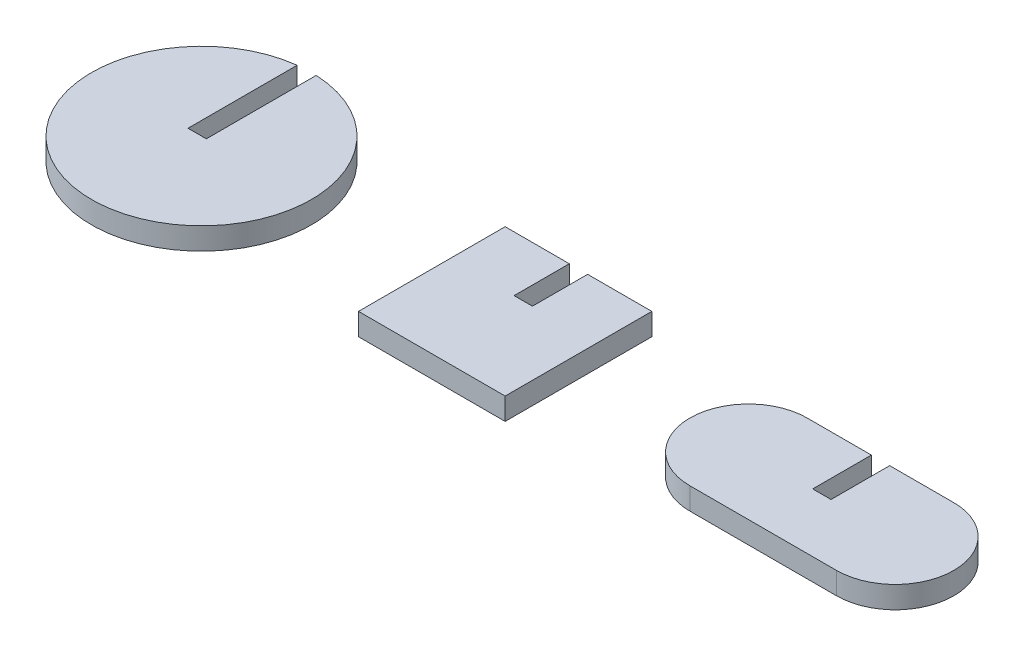
ISO-10303-21;
HEADER;
FILE_DESCRIPTION(('STEP AP214'),'2;1');
FILE_NAME('part.step','',(''),(''),'','','');
FILE_SCHEMA(('AUTOMOTIVE_DESIGN { 1 0 10303 214 1 1 1 1 }'));
ENDSEC;
DATA;
#1=APPLICATION_CONTEXT('core data for automotive mechanical design processes');
#2=APPLICATION_PROTOCOL_DEFINITION('international standard','automotive_design',2000,#1);
#3=PRODUCT_CONTEXT('',#1,'mechanical');
#4=PRODUCT('Part','Part','',(#3));
#5=PRODUCT_RELATED_PRODUCT_CATEGORY('part','',(#4));
#6=PRODUCT_DEFINITION_FORMATION('','',#4);
#7=PRODUCT_DEFINITION_CONTEXT('part definition',#1,'design');
#8=PRODUCT_DEFINITION('design','',#6,#7);
#9=PRODUCT_DEFINITION_SHAPE('','',#8);
#10=(LENGTH_UNIT() NAMED_UNIT(*) SI_UNIT(.MILLI.,.METRE.));
#11=(NAMED_UNIT(*) PLANE_ANGLE_UNIT() SI_UNIT($,.RADIAN.));
#12=(NAMED_UNIT(*) SI_UNIT($,.STERADIAN.) SOLID_ANGLE_UNIT());
#13=UNCERTAINTY_MEASURE_WITH_UNIT(LENGTH_MEASURE(1.E-05),#10,'distance_accuracy_value','');
#14=(GEOMETRIC_REPRESENTATION_CONTEXT(3) GLOBAL_UNCERTAINTY_ASSIGNED_CONTEXT((#13)) GLOBAL_UNIT_ASSIGNED_CONTEXT((#10,
#11,#12)) REPRESENTATION_CONTEXT('',''));
#15=CARTESIAN_POINT('',(0.,0.,0.));
#16=DIRECTION('',(0.,0.,1.));
#17=DIRECTION('',(1.,0.,0.));
#18=AXIS2_PLACEMENT_3D('',#15,#16,#17);
#19=CARTESIAN_POINT('',(104.876295825867,3.,1.80892643883336));
#20=DIRECTION('',(0.,-1.,0.));
#21=DIRECTION('',(0.,0.,-1.));
#22=AXIS2_PLACEMENT_3D('',#19,#20,#21);
#23=CYLINDRICAL_SURFACE('',#22,8.);
#24=CARTESIAN_POINT('',(104.876295825867,0.,1.80892643883336));
#25=DIRECTION('',(0.,1.,0.));
#26=DIRECTION('',(0.,0.,1.));
#27=AXIS2_PLACEMENT_3D('',#24,#25,#26);
#28=CIRCLE('',#27,8.);
#29=CARTESIAN_POINT('',(104.876295825867,0.,-6.19107356116664));
#30=VERTEX_POINT('',#29);
#31=CARTESIAN_POINT('',(104.876295825867,0.,9.80892643883336));
#32=VERTEX_POINT('',#31);
#33=EDGE_CURVE('E12',#30,#32,#28,.T.);
#34=ORIENTED_EDGE('',*,*,#33,.T.);
#35=DIRECTION('',(0.,-1.,0.));
#36=VECTOR('',#35,1.);
#37=CARTESIAN_POINT('',(104.876295825867,3.,9.80892643883336));
#38=LINE('',#37,#36);
#39=CARTESIAN_POINT('',(104.876295825867,3.,9.80892643883336));
#40=VERTEX_POINT('',#39);
#41=EDGE_CURVE('E187',#40,#32,#38,.T.);
#42=ORIENTED_EDGE('',*,*,#41,.F.);
#43=CARTESIAN_POINT('',(104.876295825867,3.,1.80892643883336));
#44=DIRECTION('',(0.,1.,0.));
#45=DIRECTION('',(0.,0.,1.));
#46=AXIS2_PLACEMENT_3D('',#43,#44,#45);
#47=CIRCLE('',#46,8.);
#48=CARTESIAN_POINT('',(104.876295825867,3.,-6.19107356116664));
#49=VERTEX_POINT('',#48);
#50=EDGE_CURVE('E53',#49,#40,#47,.T.);
#51=ORIENTED_EDGE('',*,*,#50,.F.);
#52=DIRECTION('',(0.,-1.,0.));
#53=VECTOR('',#52,1.);
#54=CARTESIAN_POINT('',(104.876295825867,3.,-6.19107356116664));
#55=LINE('',#54,#53);
#56=EDGE_CURVE('E152',#49,#30,#55,.T.);
#57=ORIENTED_EDGE('',*,*,#56,.T.);
#58=EDGE_LOOP('',(#34,#42,#51,#57));
#59=FACE_BOUND('',#58,.T.);
#60=ADVANCED_FACE('F49',(#59),#23,.T.);
#61=CARTESIAN_POINT('',(104.876295825867,3.,9.80892643883336));
#62=DIRECTION('',(0.,0.,-1.));
#63=DIRECTION('',(-1.,0.,0.));
#64=AXIS2_PLACEMENT_3D('',#61,#62,#63);
#65=PLANE('',#64);
#66=DIRECTION('',(1.,0.,0.));
#67=VECTOR('',#66,1.);
#68=CARTESIAN_POINT('',(104.876295825867,0.,9.80892643883336));
#69=LINE('',#68,#67);
#70=CARTESIAN_POINT('',(124.876295825867,0.,9.80892643883336));
#71=VERTEX_POINT('',#70);
#72=EDGE_CURVE('E58',#32,#71,#69,.T.);
#73=ORIENTED_EDGE('',*,*,#72,.T.);
#74=DIRECTION('',(0.,-1.,0.));
#75=VECTOR('',#74,1.);
#76=CARTESIAN_POINT('',(124.876295825867,3.,9.80892643883336));
#77=LINE('',#76,#75);
#78=CARTESIAN_POINT('',(124.876295825867,3.,9.80892643883336));
#79=VERTEX_POINT('',#78);
#80=EDGE_CURVE('E128',#79,#71,#77,.T.);
#81=ORIENTED_EDGE('',*,*,#80,.F.);
#82=DIRECTION('',(1.,0.,0.));
#83=VECTOR('',#82,1.);
#84=CARTESIAN_POINT('',(104.876295825867,3.,9.80892643883336));
#85=LINE('',#84,#83);
#86=EDGE_CURVE('E96',#40,#79,#85,.T.);
#87=ORIENTED_EDGE('',*,*,#86,.F.);
#88=ORIENTED_EDGE('',*,*,#41,.T.);
#89=EDGE_LOOP('',(#73,#81,#87,#88));
#90=FACE_BOUND('',#89,.T.);
#91=ADVANCED_FACE('F194',(#90),#65,.F.);
#92=CARTESIAN_POINT('',(124.876295825867,3.,1.80892643883336));
#93=DIRECTION('',(0.,-1.,0.));
#94=DIRECTION('',(0.,0.,-1.));
#95=AXIS2_PLACEMENT_3D('',#92,#93,#94);
#96=CYLINDRICAL_SURFACE('',#95,8.);
#97=CARTESIAN_POINT('',(124.876295825867,0.,1.80892643883336));
#98=DIRECTION('',(0.,1.,0.));
#99=DIRECTION('',(0.,0.,1.));
#100=AXIS2_PLACEMENT_3D('',#97,#98,#99);
#101=CIRCLE('',#100,8.);
#102=CARTESIAN_POINT('',(124.876295825867,0.,-6.19107356116664));
#103=VERTEX_POINT('',#102);
#104=EDGE_CURVE('E121',#71,#103,#101,.T.);
#105=ORIENTED_EDGE('',*,*,#104,.T.);
#106=DIRECTION('',(0.,-1.,0.));
#107=VECTOR('',#106,1.);
#108=CARTESIAN_POINT('',(124.876295825867,3.,-6.19107356116664));
#109=LINE('',#108,#107);
#110=CARTESIAN_POINT('',(124.876295825867,3.,-6.19107356116664));
#111=VERTEX_POINT('',#110);
#112=EDGE_CURVE('E126',#111,#103,#109,.T.);
#113=ORIENTED_EDGE('',*,*,#112,.F.);
#114=CARTESIAN_POINT('',(124.876295825867,3.,1.80892643883336));
#115=DIRECTION('',(0.,1.,0.));
#116=DIRECTION('',(0.,0.,1.));
#117=AXIS2_PLACEMENT_3D('',#114,#115,#116);
#118=CIRCLE('',#117,8.);
#119=EDGE_CURVE('E161',#79,#111,#118,.T.);
#120=ORIENTED_EDGE('',*,*,#119,.F.);
#121=ORIENTED_EDGE('',*,*,#80,.T.);
#122=EDGE_LOOP('',(#105,#113,#120,#121));
#123=FACE_BOUND('',#122,.T.);
#124=ADVANCED_FACE('F127',(#123),#96,.T.);
#125=CARTESIAN_POINT('',(116.126295825867,3.,-6.19107356116664));
#126=DIRECTION('',(0.,0.,1.));
#127=DIRECTION('',(1.,0.,0.));
#128=AXIS2_PLACEMENT_3D('',#125,#126,#127);
#129=PLANE('',#128);
#130=DIRECTION('',(-1.,0.,0.));
#131=VECTOR('',#130,1.);
#132=CARTESIAN_POINT('',(116.126295825867,0.,-6.19107356116664));
#133=LINE('',#132,#131);
#134=CARTESIAN_POINT('',(116.126295825867,0.,-6.19107356116664));
#135=VERTEX_POINT('',#134);
#136=EDGE_CURVE('E135',#103,#135,#133,.T.);
#137=ORIENTED_EDGE('',*,*,#136,.T.);
#138=DIRECTION('',(0.,-1.,0.));
#139=VECTOR('',#138,1.);
#140=CARTESIAN_POINT('',(116.126295825867,3.,-6.19107356116664));
#141=LINE('',#140,#139);
#142=CARTESIAN_POINT('',(116.126295825867,3.,-6.19107356116664));
#143=VERTEX_POINT('',#142);
#144=EDGE_CURVE('E136',#143,#135,#141,.T.);
#145=ORIENTED_EDGE('',*,*,#144,.F.);
#146=DIRECTION('',(-1.,0.,0.));
#147=VECTOR('',#146,1.);
#148=CARTESIAN_POINT('',(116.126295825867,3.,-6.19107356116664));
#149=LINE('',#148,#147);
#150=EDGE_CURVE('E140',#111,#143,#149,.T.);
#151=ORIENTED_EDGE('',*,*,#150,.F.);
#152=ORIENTED_EDGE('',*,*,#112,.T.);
#153=EDGE_LOOP('',(#137,#145,#151,#152));
#154=FACE_BOUND('',#153,.T.);
#155=ADVANCED_FACE('F133',(#154),#129,.F.);
#156=CARTESIAN_POINT('',(116.126295825867,3.,1.80892643883336));
#157=DIRECTION('',(1.,0.,0.));
#158=DIRECTION('',(0.,0.,-1.));
#159=AXIS2_PLACEMENT_3D('',#156,#157,#158);
#160=PLANE('',#159);
#161=DIRECTION('',(0.,0.,1.));
#162=VECTOR('',#161,1.);
#163=CARTESIAN_POINT('',(116.126295825867,0.,1.80892643883336));
#164=LINE('',#163,#162);
#165=CARTESIAN_POINT('',(116.126295825867,0.,1.80892643883336));
#166=VERTEX_POINT('',#165);
#167=EDGE_CURVE('E145',#135,#166,#164,.T.);
#168=ORIENTED_EDGE('',*,*,#167,.T.);
#169=DIRECTION('',(0.,-1.,0.));
#170=VECTOR('',#169,1.);
#171=CARTESIAN_POINT('',(116.126295825867,3.,1.80892643883336));
#172=LINE('',#171,#170);
#173=CARTESIAN_POINT('',(116.126295825867,3.,1.80892643883336));
#174=VERTEX_POINT('',#173);
#175=EDGE_CURVE('E180',#174,#166,#172,.T.);
#176=ORIENTED_EDGE('',*,*,#175,.F.);
#177=DIRECTION('',(0.,0.,1.));
#178=VECTOR('',#177,1.);
#179=CARTESIAN_POINT('',(116.126295825867,3.,1.80892643883336));
#180=LINE('',#179,#178);
#181=EDGE_CURVE('E158',#143,#174,#180,.T.);
#182=ORIENTED_EDGE('',*,*,#181,.F.);
#183=ORIENTED_EDGE('',*,*,#144,.T.);
#184=EDGE_LOOP('',(#168,#176,#182,#183));
#185=FACE_BOUND('',#184,.T.);
#186=ADVANCED_FACE('F193',(#185),#160,.F.);
#187=CARTESIAN_POINT('',(113.626295825867,3.,1.80892643883336));
#188=DIRECTION('',(0.,0.,1.));
#189=DIRECTION('',(1.,0.,0.));
#190=AXIS2_PLACEMENT_3D('',#187,#188,#189);
#191=PLANE('',#190);
#192=DIRECTION('',(-1.,0.,0.));
#193=VECTOR('',#192,1.);
#194=CARTESIAN_POINT('',(113.626295825867,0.,1.80892643883336));
#195=LINE('',#194,#193);
#196=CARTESIAN_POINT('',(113.626295825867,0.,1.80892643883336));
#197=VERTEX_POINT('',#196);
#198=EDGE_CURVE('E148',#166,#197,#195,.T.);
#199=ORIENTED_EDGE('',*,*,#198,.T.);
#200=DIRECTION('',(0.,-1.,0.));
#201=VECTOR('',#200,1.);
#202=CARTESIAN_POINT('',(113.626295825867,3.,1.80892643883336));
#203=LINE('',#202,#201);
#204=CARTESIAN_POINT('',(113.626295825867,3.,1.80892643883336));
#205=VERTEX_POINT('',#204);
#206=EDGE_CURVE('E173',#205,#197,#203,.T.);
#207=ORIENTED_EDGE('',*,*,#206,.F.);
#208=DIRECTION('',(-1.,0.,0.));
#209=VECTOR('',#208,1.);
#210=CARTESIAN_POINT('',(113.626295825867,3.,1.80892643883336));
#211=LINE('',#210,#209);
#212=EDGE_CURVE('E156',#174,#205,#211,.T.);
#213=ORIENTED_EDGE('',*,*,#212,.F.);
#214=ORIENTED_EDGE('',*,*,#175,.T.);
#215=EDGE_LOOP('',(#199,#207,#213,#214));
#216=FACE_BOUND('',#215,.T.);
#217=ADVANCED_FACE('F174',(#216),#191,.F.);
#218=CARTESIAN_POINT('',(113.626295825867,3.,1.80892643883336));
#219=DIRECTION('',(-1.,0.,0.));
#220=DIRECTION('',(0.,0.,1.));
#221=AXIS2_PLACEMENT_3D('',#218,#219,#220);
#222=PLANE('',#221);
#223=DIRECTION('',(0.,0.,-1.));
#224=VECTOR('',#223,1.);
#225=CARTESIAN_POINT('',(113.626295825867,0.,1.80892643883336));
#226=LINE('',#225,#224);
#227=CARTESIAN_POINT('',(113.626295825867,0.,-6.19107356116664));
#228=VERTEX_POINT('',#227);
#229=EDGE_CURVE('E163',#197,#228,#226,.T.);
#230=ORIENTED_EDGE('',*,*,#229,.T.);
#231=DIRECTION('',(0.,-1.,0.));
#232=VECTOR('',#231,1.);
#233=CARTESIAN_POINT('',(113.626295825867,3.,-6.19107356116664));
#234=LINE('',#233,#232);
#235=CARTESIAN_POINT('',(113.626295825867,3.,-6.19107356116664));
#236=VERTEX_POINT('',#235);
#237=EDGE_CURVE('E181',#236,#228,#234,.T.);
#238=ORIENTED_EDGE('',*,*,#237,.F.);
#239=DIRECTION('',(0.,0.,-1.));
#240=VECTOR('',#239,1.);
#241=CARTESIAN_POINT('',(113.626295825867,3.,1.80892643883336));
#242=LINE('',#241,#240);
#243=EDGE_CURVE('E153',#205,#236,#242,.T.);
#244=ORIENTED_EDGE('',*,*,#243,.F.);
#245=ORIENTED_EDGE('',*,*,#206,.T.);
#246=EDGE_LOOP('',(#230,#238,#244,#245));
#247=FACE_BOUND('',#246,.T.);
#248=ADVANCED_FACE('F182',(#247),#222,.F.);
#249=CARTESIAN_POINT('',(104.876295825867,3.,-6.19107356116664));
#250=DIRECTION('',(0.,0.,1.));
#251=DIRECTION('',(1.,0.,0.));
#252=AXIS2_PLACEMENT_3D('',#249,#250,#251);
#253=PLANE('',#252);
#254=DIRECTION('',(-1.,0.,0.));
#255=VECTOR('',#254,1.);
#256=CARTESIAN_POINT('',(104.876295825867,0.,-6.19107356116664));
#257=LINE('',#256,#255);
#258=EDGE_CURVE('E110',#228,#30,#257,.T.);
#259=ORIENTED_EDGE('',*,*,#258,.T.);
#260=ORIENTED_EDGE('',*,*,#56,.F.);
#261=DIRECTION('',(-1.,0.,0.));
#262=VECTOR('',#261,1.);
#263=CARTESIAN_POINT('',(104.876295825867,3.,-6.19107356116664));
#264=LINE('',#263,#262);
#265=EDGE_CURVE('E151',#236,#49,#264,.T.);
#266=ORIENTED_EDGE('',*,*,#265,.F.);
#267=ORIENTED_EDGE('',*,*,#237,.T.);
#268=EDGE_LOOP('',(#259,#260,#266,#267));
#269=FACE_BOUND('',#268,.T.);
#270=ADVANCED_FACE('F198',(#269),#253,.F.);
#271=CARTESIAN_POINT('',(104.876295825867,3.,1.80892643883336));
#272=DIRECTION('',(0.,1.,0.));
#273=DIRECTION('',(0.,0.,1.));
#274=AXIS2_PLACEMENT_3D('',#271,#272,#273);
#275=PLANE('',#274);
#276=ORIENTED_EDGE('',*,*,#50,.T.);
#277=ORIENTED_EDGE('',*,*,#86,.T.);
#278=ORIENTED_EDGE('',*,*,#119,.T.);
#279=ORIENTED_EDGE('',*,*,#150,.T.);
#280=ORIENTED_EDGE('',*,*,#181,.T.);
#281=ORIENTED_EDGE('',*,*,#212,.T.);
#282=ORIENTED_EDGE('',*,*,#243,.T.);
#283=ORIENTED_EDGE('',*,*,#265,.T.);
#284=EDGE_LOOP('',(#276,#277,#278,#279,#280,#281,#282,#283));
#285=FACE_BOUND('',#284,.T.);
#286=ADVANCED_FACE('F55',(#285),#275,.T.);
#287=CARTESIAN_POINT('',(104.876295825867,0.,1.80892643883336));
#288=DIRECTION('',(0.,1.,0.));
#289=DIRECTION('',(0.,0.,1.));
#290=AXIS2_PLACEMENT_3D('',#287,#288,#289);
#291=PLANE('',#290);
#292=ORIENTED_EDGE('',*,*,#33,.F.);
#293=ORIENTED_EDGE('',*,*,#258,.F.);
#294=ORIENTED_EDGE('',*,*,#229,.F.);
#295=ORIENTED_EDGE('',*,*,#198,.F.);
#296=ORIENTED_EDGE('',*,*,#167,.F.);
#297=ORIENTED_EDGE('',*,*,#136,.F.);
#298=ORIENTED_EDGE('',*,*,#104,.F.);
#299=ORIENTED_EDGE('',*,*,#72,.F.);
#300=EDGE_LOOP('',(#292,#293,#294,#295,#296,#297,#298,#299));
#301=FACE_BOUND('',#300,.T.);
#302=ADVANCED_FACE('F142',(#301),#291,.F.);
#303=CLOSED_SHELL('',(#60,#91,#124,#155,#186,#217,#248,#270,#286,#302));
#304=MANIFOLD_SOLID_BREP('B2',#303);
#305=CARTESIAN_POINT('',(30.9354130775893,3.,-13.1764873648477));
#306=DIRECTION('',(1.,0.,0.));
#307=DIRECTION('',(0.,0.,-1.));
#308=AXIS2_PLACEMENT_3D('',#305,#306,#307);
#309=PLANE('',#308);
#310=DIRECTION('',(0.,0.,1.));
#311=VECTOR('',#310,1.);
#312=CARTESIAN_POINT('',(30.9354130775893,0.,-13.1764873648477));
#313=LINE('',#312,#311);
#314=CARTESIAN_POINT('',(30.9354130775893,0.,-13.1764873648477));
#315=VERTEX_POINT('',#314);
#316=CARTESIAN_POINT('',(30.9354130775893,0.,1.80892643883336));
#317=VERTEX_POINT('',#316);
#318=EDGE_CURVE('E48',#315,#317,#313,.T.);
#319=ORIENTED_EDGE('',*,*,#318,.T.);
#320=DIRECTION('',(0.,-1.,0.));
#321=VECTOR('',#320,1.);
#322=CARTESIAN_POINT('',(30.9354130775893,3.,1.80892643883336));
#323=LINE('',#322,#321);
#324=CARTESIAN_POINT('',(30.9354130775893,3.,1.80892643883336));
#325=VERTEX_POINT('',#324);
#326=EDGE_CURVE('E360',#325,#317,#323,.T.);
#327=ORIENTED_EDGE('',*,*,#326,.F.);
#328=DIRECTION('',(0.,0.,1.));
#329=VECTOR('',#328,1.);
#330=CARTESIAN_POINT('',(30.9354130775893,3.,-13.1764873648477));
#331=LINE('',#330,#329);
#332=CARTESIAN_POINT('',(30.9354130775893,3.,-13.1764873648477));
#333=VERTEX_POINT('',#332);
#334=EDGE_CURVE('E292',#333,#325,#331,.T.);
#335=ORIENTED_EDGE('',*,*,#334,.F.);
#336=DIRECTION('',(0.,-1.,0.));
#337=VECTOR('',#336,1.);
#338=CARTESIAN_POINT('',(30.9354130775893,3.,-13.1764873648477));
#339=LINE('',#338,#337);
#340=EDGE_CURVE('E347',#333,#315,#339,.T.);
#341=ORIENTED_EDGE('',*,*,#340,.T.);
#342=EDGE_LOOP('',(#319,#327,#335,#341));
#343=FACE_BOUND('',#342,.T.);
#344=ADVANCED_FACE('F289',(#343),#309,.F.);
#345=CARTESIAN_POINT('',(28.4354130775893,3.,1.80892643883336));
#346=DIRECTION('',(0.,0.,1.));
#347=DIRECTION('',(1.,0.,0.));
#348=AXIS2_PLACEMENT_3D('',#345,#346,#347);
#349=PLANE('',#348);
#350=DIRECTION('',(-1.,0.,0.));
#351=VECTOR('',#350,1.);
#352=CARTESIAN_POINT('',(28.4354130775893,0.,1.80892643883336));
#353=LINE('',#352,#351);
#354=CARTESIAN_POINT('',(28.4354130775893,0.,1.80892643883336));
#355=VERTEX_POINT('',#354);
#356=EDGE_CURVE('E300',#317,#355,#353,.T.);
#357=ORIENTED_EDGE('',*,*,#356,.T.);
#358=DIRECTION('',(0.,-1.,0.));
#359=VECTOR('',#358,1.);
#360=CARTESIAN_POINT('',(28.4354130775893,3.,1.80892643883336));
#361=LINE('',#360,#359);
#362=CARTESIAN_POINT('',(28.4354130775893,3.,1.80892643883336));
#363=VERTEX_POINT('',#362);
#364=EDGE_CURVE('E344',#363,#355,#361,.T.);
#365=ORIENTED_EDGE('',*,*,#364,.F.);
#366=DIRECTION('',(-1.,0.,0.));
#367=VECTOR('',#366,1.);
#368=CARTESIAN_POINT('',(28.4354130775893,3.,1.80892643883336));
#369=LINE('',#368,#367);
#370=EDGE_CURVE('E321',#325,#363,#369,.T.);
#371=ORIENTED_EDGE('',*,*,#370,.F.);
#372=ORIENTED_EDGE('',*,*,#326,.T.);
#373=EDGE_LOOP('',(#357,#365,#371,#372));
#374=FACE_BOUND('',#373,.T.);
#375=ADVANCED_FACE('F363',(#374),#349,.F.);
#376=CARTESIAN_POINT('',(28.4354130775893,3.,-13.0779582741391));
#377=DIRECTION('',(-1.,0.,0.));
#378=DIRECTION('',(0.,0.,1.));
#379=AXIS2_PLACEMENT_3D('',#376,#377,#378);
#380=PLANE('',#379);
#381=DIRECTION('',(0.,0.,-1.));
#382=VECTOR('',#381,1.);
#383=CARTESIAN_POINT('',(28.4354130775893,0.,-13.0779582741391));
#384=LINE('',#383,#382);
#385=CARTESIAN_POINT('',(28.4354130775893,0.,-13.0779582741391));
#386=VERTEX_POINT('',#385);
#387=EDGE_CURVE('E340',#355,#386,#384,.T.);
#388=ORIENTED_EDGE('',*,*,#387,.T.);
#389=DIRECTION('',(0.,-1.,0.));
#390=VECTOR('',#389,1.);
#391=CARTESIAN_POINT('',(28.4354130775893,3.,-13.0779582741391));
#392=LINE('',#391,#390);
#393=CARTESIAN_POINT('',(28.4354130775893,3.,-13.0779582741391));
#394=VERTEX_POINT('',#393);
#395=EDGE_CURVE('E338',#394,#386,#392,.T.);
#396=ORIENTED_EDGE('',*,*,#395,.F.);
#397=DIRECTION('',(0.,0.,-1.));
#398=VECTOR('',#397,1.);
#399=CARTESIAN_POINT('',(28.4354130775893,3.,-13.0779582741391));
#400=LINE('',#399,#398);
#401=EDGE_CURVE('E351',#363,#394,#400,.T.);
#402=ORIENTED_EDGE('',*,*,#401,.F.);
#403=ORIENTED_EDGE('',*,*,#364,.T.);
#404=EDGE_LOOP('',(#388,#396,#402,#403));
#405=FACE_BOUND('',#404,.T.);
#406=ADVANCED_FACE('F339',(#405),#380,.F.);
#407=CARTESIAN_POINT('',(30.2740711596334,3.,1.80892643883336));
#408=DIRECTION('',(0.,-1.,0.));
#409=DIRECTION('',(0.,0.,-1.));
#410=AXIS2_PLACEMENT_3D('',#407,#408,#409);
#411=CYLINDRICAL_SURFACE('',#410,15.);
#412=CARTESIAN_POINT('',(30.2740711596334,0.,1.80892643883336));
#413=DIRECTION('',(0.,1.,0.));
#414=DIRECTION('',(0.,0.,1.));
#415=AXIS2_PLACEMENT_3D('',#412,#413,#414);
#416=CIRCLE('',#415,15.);
#417=EDGE_CURVE('E332',#386,#315,#416,.T.);
#418=ORIENTED_EDGE('',*,*,#417,.T.);
#419=ORIENTED_EDGE('',*,*,#340,.F.);
#420=CARTESIAN_POINT('',(30.2740711596334,3.,1.80892643883336));
#421=DIRECTION('',(0.,1.,0.));
#422=DIRECTION('',(0.,0.,1.));
#423=AXIS2_PLACEMENT_3D('',#420,#421,#422);
#424=CIRCLE('',#423,15.);
#425=EDGE_CURVE('E343',#394,#333,#424,.T.);
#426=ORIENTED_EDGE('',*,*,#425,.F.);
#427=ORIENTED_EDGE('',*,*,#395,.T.);
#428=EDGE_LOOP('',(#418,#419,#426,#427));
#429=FACE_BOUND('',#428,.T.);
#430=ADVANCED_FACE('F341',(#429),#411,.T.);
#431=CARTESIAN_POINT('',(30.2740711596334,3.,1.80892643883336));
#432=DIRECTION('',(0.,1.,0.));
#433=DIRECTION('',(0.,0.,1.));
#434=AXIS2_PLACEMENT_3D('',#431,#432,#433);
#435=PLANE('',#434);
#436=ORIENTED_EDGE('',*,*,#334,.T.);
#437=ORIENTED_EDGE('',*,*,#370,.T.);
#438=ORIENTED_EDGE('',*,*,#401,.T.);
#439=ORIENTED_EDGE('',*,*,#425,.T.);
#440=EDGE_LOOP('',(#436,#437,#438,#439));
#441=FACE_BOUND('',#440,.T.);
#442=ADVANCED_FACE('F286',(#441),#435,.T.);
#443=CARTESIAN_POINT('',(30.2740711596334,0.,1.80892643883336));
#444=DIRECTION('',(0.,1.,0.));
#445=DIRECTION('',(0.,0.,1.));
#446=AXIS2_PLACEMENT_3D('',#443,#444,#445);
#447=PLANE('',#446);
#448=ORIENTED_EDGE('',*,*,#318,.F.);
#449=ORIENTED_EDGE('',*,*,#417,.F.);
#450=ORIENTED_EDGE('',*,*,#387,.F.);
#451=ORIENTED_EDGE('',*,*,#356,.F.);
#452=EDGE_LOOP('',(#448,#449,#450,#451));
#453=FACE_BOUND('',#452,.T.);
#454=ADVANCED_FACE('F346',(#453),#447,.F.);
#455=CLOSED_SHELL('',(#344,#375,#406,#430,#442,#454));
#456=MANIFOLD_SOLID_BREP('B6',#455);
#457=CARTESIAN_POINT('',(72.9372526382803,3.,-8.19107356116664));
#458=DIRECTION('',(0.,0.,1.));
#459=DIRECTION('',(1.,0.,0.));
#460=AXIS2_PLACEMENT_3D('',#457,#458,#459);
#461=PLANE('',#460);
#462=DIRECTION('',(-1.,0.,0.));
#463=VECTOR('',#462,1.);
#464=CARTESIAN_POINT('',(72.9372526382803,0.,-8.19107356116664));
#465=LINE('',#464,#463);
#466=CARTESIAN_POINT('',(81.6872526382803,0.,-8.19107356116664));
#467=VERTEX_POINT('',#466);
#468=CARTESIAN_POINT('',(72.9372526382803,0.,-8.19107356116664));
#469=VERTEX_POINT('',#468);
#470=EDGE_CURVE('E509',#467,#469,#465,.T.);
#471=ORIENTED_EDGE('',*,*,#470,.T.);
#472=DIRECTION('',(0.,-1.,0.));
#473=VECTOR('',#472,1.);
#474=CARTESIAN_POINT('',(72.9372526382803,3.,-8.19107356116664));
#475=LINE('',#474,#473);
#476=CARTESIAN_POINT('',(72.9372526382803,3.,-8.19107356116664));
#477=VERTEX_POINT('',#476);
#478=EDGE_CURVE('E283',#477,#469,#475,.T.);
#479=ORIENTED_EDGE('',*,*,#478,.F.);
#480=DIRECTION('',(-1.,0.,0.));
#481=VECTOR('',#480,1.);
#482=CARTESIAN_POINT('',(72.9372526382803,3.,-8.19107356116664));
#483=LINE('',#482,#481);
#484=CARTESIAN_POINT('',(81.6872526382803,3.,-8.19107356116664));
#485=VERTEX_POINT('',#484);
#486=EDGE_CURVE('E522',#485,#477,#483,.T.);
#487=ORIENTED_EDGE('',*,*,#486,.F.);
#488=DIRECTION('',(0.,-1.,0.));
#489=VECTOR('',#488,1.);
#490=CARTESIAN_POINT('',(81.6872526382803,3.,-8.19107356116664));
#491=LINE('',#490,#489);
#492=EDGE_CURVE('E504',#485,#467,#491,.T.);
#493=ORIENTED_EDGE('',*,*,#492,.T.);
#494=EDGE_LOOP('',(#471,#479,#487,#493));
#495=FACE_BOUND('',#494,.T.);
#496=ADVANCED_FACE('F412',(#495),#461,.F.);
#497=CARTESIAN_POINT('',(72.9372526382803,3.,-0.658425470916885));
#498=DIRECTION('',(1.,0.,0.));
#499=DIRECTION('',(0.,0.,-1.));
#500=AXIS2_PLACEMENT_3D('',#497,#498,#499);
#501=PLANE('',#500);
#502=DIRECTION('',(0.,0.,1.));
#503=VECTOR('',#502,1.);
#504=CARTESIAN_POINT('',(72.9372526382803,0.,-0.658425470916885));
#505=LINE('',#504,#503);
#506=CARTESIAN_POINT('',(72.9372526382803,0.,-0.658425470916885));
#507=VERTEX_POINT('',#506);
#508=EDGE_CURVE('E508',#469,#507,#505,.T.);
#509=ORIENTED_EDGE('',*,*,#508,.T.);
#510=DIRECTION('',(0.,-1.,0.));
#511=VECTOR('',#510,1.);
#512=CARTESIAN_POINT('',(72.9372526382803,3.,-0.658425470916885));
#513=LINE('',#512,#511);
#514=CARTESIAN_POINT('',(72.9372526382803,3.,-0.658425470916885));
#515=VERTEX_POINT('',#514);
#516=EDGE_CURVE('E420',#515,#507,#513,.T.);
#517=ORIENTED_EDGE('',*,*,#516,.F.);
#518=DIRECTION('',(0.,0.,1.));
#519=VECTOR('',#518,1.);
#520=CARTESIAN_POINT('',(72.9372526382803,3.,-0.658425470916885));
#521=LINE('',#520,#519);
#522=EDGE_CURVE('E468',#477,#515,#521,.T.);
#523=ORIENTED_EDGE('',*,*,#522,.F.);
#524=ORIENTED_EDGE('',*,*,#478,.T.);
#525=EDGE_LOOP('',(#509,#517,#523,#524));
#526=FACE_BOUND('',#525,.T.);
#527=ADVANCED_FACE('F557',(#526),#501,.F.);
#528=CARTESIAN_POINT('',(70.4372526382803,3.,-0.658425470916885));
#529=DIRECTION('',(0.,0.,1.));
#530=DIRECTION('',(1.,0.,0.));
#531=AXIS2_PLACEMENT_3D('',#528,#529,#530);
#532=PLANE('',#531);
#533=DIRECTION('',(-1.,0.,0.));
#534=VECTOR('',#533,1.);
#535=CARTESIAN_POINT('',(70.4372526382803,0.,-0.658425470916885));
#536=LINE('',#535,#534);
#537=CARTESIAN_POINT('',(70.4372526382803,0.,-0.658425470916885));
#538=VERTEX_POINT('',#537);
#539=EDGE_CURVE('E515',#507,#538,#536,.T.);
#540=ORIENTED_EDGE('',*,*,#539,.T.);
#541=DIRECTION('',(0.,-1.,0.));
#542=VECTOR('',#541,1.);
#543=CARTESIAN_POINT('',(70.4372526382803,3.,-0.658425470916885));
#544=LINE('',#543,#542);
#545=CARTESIAN_POINT('',(70.4372526382803,3.,-0.658425470916885));
#546=VERTEX_POINT('',#545);
#547=EDGE_CURVE('E526',#546,#538,#544,.T.);
#548=ORIENTED_EDGE('',*,*,#547,.F.);
#549=DIRECTION('',(-1.,0.,0.));
#550=VECTOR('',#549,1.);
#551=CARTESIAN_POINT('',(70.4372526382803,3.,-0.658425470916885));
#552=LINE('',#551,#550);
#553=EDGE_CURVE('E536',#515,#546,#552,.T.);
#554=ORIENTED_EDGE('',*,*,#553,.F.);
#555=ORIENTED_EDGE('',*,*,#516,.T.);
#556=EDGE_LOOP('',(#540,#548,#554,#555));
#557=FACE_BOUND('',#556,.T.);
#558=ADVANCED_FACE('F534',(#557),#532,.F.);
#559=CARTESIAN_POINT('',(70.4372526382803,3.,-0.658425470916885));
#560=DIRECTION('',(-1.,0.,0.));
#561=DIRECTION('',(0.,0.,1.));
#562=AXIS2_PLACEMENT_3D('',#559,#560,#561);
#563=PLANE('',#562);
#564=DIRECTION('',(0.,0.,-1.));
#565=VECTOR('',#564,1.);
#566=CARTESIAN_POINT('',(70.4372526382803,0.,-0.658425470916885));
#567=LINE('',#566,#565);
#568=CARTESIAN_POINT('',(70.4372526382803,0.,-8.19107356116664));
#569=VERTEX_POINT('',#568);
#570=EDGE_CURVE('E514',#538,#569,#567,.T.);
#571=ORIENTED_EDGE('',*,*,#570,.T.);
#572=DIRECTION('',(0.,-1.,0.));
#573=VECTOR('',#572,1.);
#574=CARTESIAN_POINT('',(70.4372526382803,3.,-8.19107356116664));
#575=LINE('',#574,#573);
#576=CARTESIAN_POINT('',(70.4372526382803,3.,-8.19107356116664));
#577=VERTEX_POINT('',#576);
#578=EDGE_CURVE('E523',#577,#569,#575,.T.);
#579=ORIENTED_EDGE('',*,*,#578,.F.);
#580=DIRECTION('',(0.,0.,-1.));
#581=VECTOR('',#580,1.);
#582=CARTESIAN_POINT('',(70.4372526382803,3.,-0.658425470916885));
#583=LINE('',#582,#581);
#584=EDGE_CURVE('E547',#546,#577,#583,.T.);
#585=ORIENTED_EDGE('',*,*,#584,.F.);
#586=ORIENTED_EDGE('',*,*,#547,.T.);
#587=EDGE_LOOP('',(#571,#579,#585,#586));
#588=FACE_BOUND('',#587,.T.);
#589=ADVANCED_FACE('F542',(#588),#563,.F.);
#590=CARTESIAN_POINT('',(61.6872526382803,3.,-8.19107356116664));
#591=DIRECTION('',(0.,0.,1.));
#592=DIRECTION('',(1.,0.,0.));
#593=AXIS2_PLACEMENT_3D('',#590,#591,#592);
#594=PLANE('',#593);
#595=DIRECTION('',(-1.,0.,0.));
#596=VECTOR('',#595,1.);
#597=CARTESIAN_POINT('',(61.6872526382803,0.,-8.19107356116664));
#598=LINE('',#597,#596);
#599=CARTESIAN_POINT('',(61.6872526382803,0.,-8.19107356116664));
#600=VERTEX_POINT('',#599);
#601=EDGE_CURVE('E517',#569,#600,#598,.T.);
#602=ORIENTED_EDGE('',*,*,#601,.T.);
#603=DIRECTION('',(0.,-1.,0.));
#604=VECTOR('',#603,1.);
#605=CARTESIAN_POINT('',(61.6872526382803,3.,-8.19107356116664));
#606=LINE('',#605,#604);
#607=CARTESIAN_POINT('',(61.6872526382803,3.,-8.19107356116664));
#608=VERTEX_POINT('',#607);
#609=EDGE_CURVE('E499',#608,#600,#606,.T.);
#610=ORIENTED_EDGE('',*,*,#609,.F.);
#611=DIRECTION('',(-1.,0.,0.));
#612=VECTOR('',#611,1.);
#613=CARTESIAN_POINT('',(61.6872526382803,3.,-8.19107356116664));
#614=LINE('',#613,#612);
#615=EDGE_CURVE('E487',#577,#608,#614,.T.);
#616=ORIENTED_EDGE('',*,*,#615,.F.);
#617=ORIENTED_EDGE('',*,*,#578,.T.);
#618=EDGE_LOOP('',(#602,#610,#616,#617));
#619=FACE_BOUND('',#618,.T.);
#620=ADVANCED_FACE('F550',(#619),#594,.F.);
#621=CARTESIAN_POINT('',(61.6872526382803,3.,11.8089264388334));
#622=DIRECTION('',(1.,0.,0.));
#623=DIRECTION('',(0.,0.,-1.));
#624=AXIS2_PLACEMENT_3D('',#621,#622,#623);
#625=PLANE('',#624);
#626=DIRECTION('',(0.,0.,1.));
#627=VECTOR('',#626,1.);
#628=CARTESIAN_POINT('',(61.6872526382803,0.,11.8089264388334));
#629=LINE('',#628,#627);
#630=CARTESIAN_POINT('',(61.6872526382803,0.,11.8089264388334));
#631=VERTEX_POINT('',#630);
#632=EDGE_CURVE('E500',#600,#631,#629,.T.);
#633=ORIENTED_EDGE('',*,*,#632,.T.);
#634=DIRECTION('',(0.,-1.,0.));
#635=VECTOR('',#634,1.);
#636=CARTESIAN_POINT('',(61.6872526382803,3.,11.8089264388334));
#637=LINE('',#636,#635);
#638=CARTESIAN_POINT('',(61.6872526382803,3.,11.8089264388334));
#639=VERTEX_POINT('',#638);
#640=EDGE_CURVE('E493',#639,#631,#637,.T.);
#641=ORIENTED_EDGE('',*,*,#640,.F.);
#642=DIRECTION('',(0.,0.,1.));
#643=VECTOR('',#642,1.);
#644=CARTESIAN_POINT('',(61.6872526382803,3.,11.8089264388334));
#645=LINE('',#644,#643);
#646=EDGE_CURVE('E483',#608,#639,#645,.T.);
#647=ORIENTED_EDGE('',*,*,#646,.F.);
#648=ORIENTED_EDGE('',*,*,#609,.T.);
#649=EDGE_LOOP('',(#633,#641,#647,#648));
#650=FACE_BOUND('',#649,.T.);
#651=ADVANCED_FACE('F494',(#650),#625,.F.);
#652=CARTESIAN_POINT('',(61.6872526382803,3.,11.8089264388334));
#653=DIRECTION('',(0.,0.,-1.));
#654=DIRECTION('',(-1.,0.,0.));
#655=AXIS2_PLACEMENT_3D('',#652,#653,#654);
#656=PLANE('',#655);
#657=DIRECTION('',(1.,0.,0.));
#658=VECTOR('',#657,1.);
#659=CARTESIAN_POINT('',(61.6872526382803,0.,11.8089264388334));
#660=LINE('',#659,#658);
#661=CARTESIAN_POINT('',(81.6872526382803,0.,11.8089264388334));
#662=VERTEX_POINT('',#661);
#663=EDGE_CURVE('E457',#631,#662,#660,.T.);
#664=ORIENTED_EDGE('',*,*,#663,.T.);
#665=DIRECTION('',(0.,-1.,0.));
#666=VECTOR('',#665,1.);
#667=CARTESIAN_POINT('',(81.6872526382803,3.,11.8089264388334));
#668=LINE('',#667,#666);
#669=CARTESIAN_POINT('',(81.6872526382803,3.,11.8089264388334));
#670=VERTEX_POINT('',#669);
#671=EDGE_CURVE('E496',#670,#662,#668,.T.);
#672=ORIENTED_EDGE('',*,*,#671,.F.);
#673=DIRECTION('',(1.,0.,0.));
#674=VECTOR('',#673,1.);
#675=CARTESIAN_POINT('',(61.6872526382803,3.,11.8089264388334));
#676=LINE('',#675,#674);
#677=EDGE_CURVE('E490',#639,#670,#676,.T.);
#678=ORIENTED_EDGE('',*,*,#677,.F.);
#679=ORIENTED_EDGE('',*,*,#640,.T.);
#680=EDGE_LOOP('',(#664,#672,#678,#679));
#681=FACE_BOUND('',#680,.T.);
#682=ADVANCED_FACE('F502',(#681),#656,.F.);
#683=CARTESIAN_POINT('',(81.6872526382803,3.,11.8089264388334));
#684=DIRECTION('',(-1.,0.,0.));
#685=DIRECTION('',(0.,0.,1.));
#686=AXIS2_PLACEMENT_3D('',#683,#684,#685);
#687=PLANE('',#686);
#688=DIRECTION('',(0.,0.,-1.));
#689=VECTOR('',#688,1.);
#690=CARTESIAN_POINT('',(81.6872526382803,0.,11.8089264388334));
#691=LINE('',#690,#689);
#692=EDGE_CURVE('E465',#662,#467,#691,.T.);
#693=ORIENTED_EDGE('',*,*,#692,.T.);
#694=ORIENTED_EDGE('',*,*,#492,.F.);
#695=DIRECTION('',(0.,0.,-1.));
#696=VECTOR('',#695,1.);
#697=CARTESIAN_POINT('',(81.6872526382803,3.,11.8089264388334));
#698=LINE('',#697,#696);
#699=EDGE_CURVE('E430',#670,#485,#698,.T.);
#700=ORIENTED_EDGE('',*,*,#699,.F.);
#701=ORIENTED_EDGE('',*,*,#671,.T.);
#702=EDGE_LOOP('',(#693,#694,#700,#701));
#703=FACE_BOUND('',#702,.T.);
#704=ADVANCED_FACE('F575',(#703),#687,.F.);
#705=CARTESIAN_POINT('',(0.,3.,0.));
#706=DIRECTION('',(0.,1.,0.));
#707=DIRECTION('',(0.,0.,1.));
#708=AXIS2_PLACEMENT_3D('',#705,#706,#707);
#709=PLANE('',#708);
#710=ORIENTED_EDGE('',*,*,#486,.T.);
#711=ORIENTED_EDGE('',*,*,#522,.T.);
#712=ORIENTED_EDGE('',*,*,#553,.T.);
#713=ORIENTED_EDGE('',*,*,#584,.T.);
#714=ORIENTED_EDGE('',*,*,#615,.T.);
#715=ORIENTED_EDGE('',*,*,#646,.T.);
#716=ORIENTED_EDGE('',*,*,#677,.T.);
#717=ORIENTED_EDGE('',*,*,#699,.T.);
#718=EDGE_LOOP('',(#710,#711,#712,#713,#714,#715,#716,#717));
#719=FACE_BOUND('',#718,.T.);
#720=ADVANCED_FACE('F484',(#719),#709,.T.);
#721=CARTESIAN_POINT('',(0.,0.,0.));
#722=DIRECTION('',(0.,1.,0.));
#723=DIRECTION('',(0.,0.,1.));
#724=AXIS2_PLACEMENT_3D('',#721,#722,#723);
#725=PLANE('',#724);
#726=ORIENTED_EDGE('',*,*,#470,.F.);
#727=ORIENTED_EDGE('',*,*,#692,.F.);
#728=ORIENTED_EDGE('',*,*,#663,.F.);
#729=ORIENTED_EDGE('',*,*,#632,.F.);
#730=ORIENTED_EDGE('',*,*,#601,.F.);
#731=ORIENTED_EDGE('',*,*,#570,.F.);
#732=ORIENTED_EDGE('',*,*,#539,.F.);
#733=ORIENTED_EDGE('',*,*,#508,.F.);
#734=EDGE_LOOP('',(#726,#727,#728,#729,#730,#731,#732,#733));
#735=FACE_BOUND('',#734,.T.);
#736=ADVANCED_FACE('F539',(#735),#725,.F.);
#737=CLOSED_SHELL('',(#496,#527,#558,#589,#620,#651,#682,#704,#720,#736));
#738=MANIFOLD_SOLID_BREP('B45',#737);
#739=ADVANCED_BREP_SHAPE_REPRESENTATION('',(#18,#304,#456,#738),#14);
#740=SHAPE_DEFINITION_REPRESENTATION(#9,#739);
ENDSEC;
END-ISO-10303-21;
